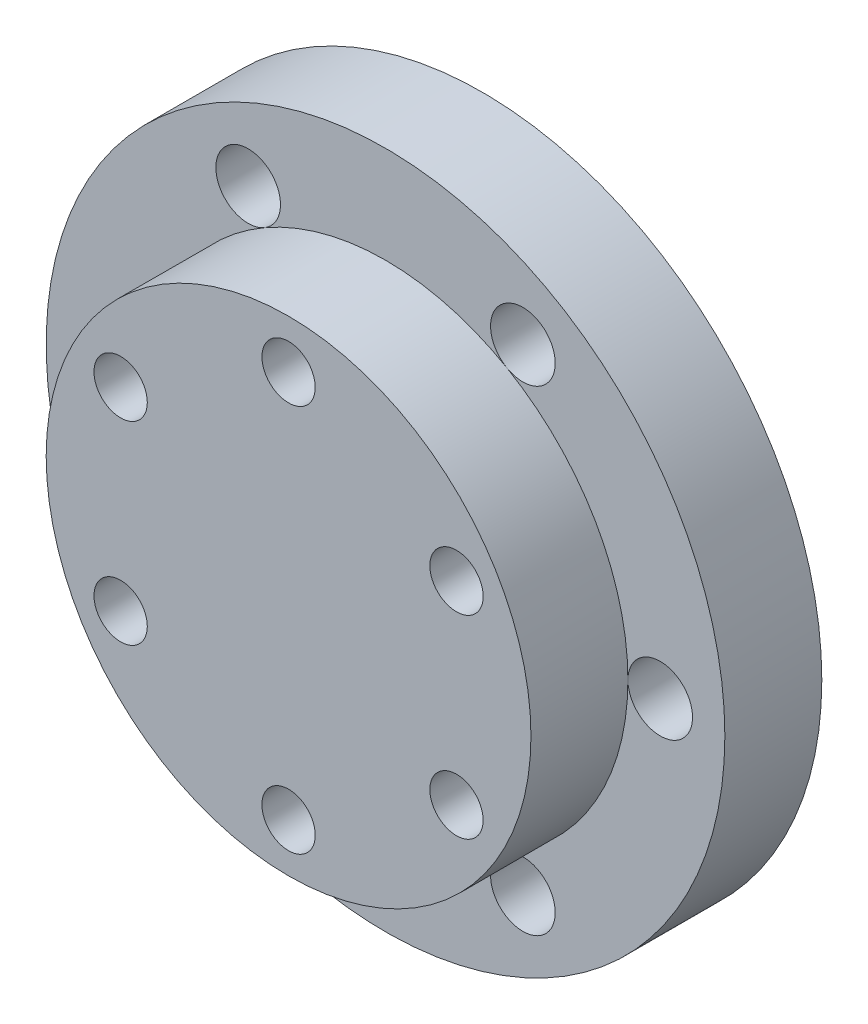
ISO-10303-21;
HEADER;
FILE_DESCRIPTION(('STEP AP214'),'2;1');
FILE_NAME('part.step','',(''),(''),'','','');
FILE_SCHEMA(('AUTOMOTIVE_DESIGN { 1 0 10303 214 1 1 1 1 }'));
ENDSEC;
DATA;
#1=APPLICATION_CONTEXT('core data for automotive mechanical design processes');
#2=APPLICATION_PROTOCOL_DEFINITION('international standard','automotive_design',2000,#1);
#3=PRODUCT_CONTEXT('',#1,'mechanical');
#4=PRODUCT('Part','Part','',(#3));
#5=PRODUCT_RELATED_PRODUCT_CATEGORY('part','',(#4));
#6=PRODUCT_DEFINITION_FORMATION('','',#4);
#7=PRODUCT_DEFINITION_CONTEXT('part definition',#1,'design');
#8=PRODUCT_DEFINITION('design','',#6,#7);
#9=PRODUCT_DEFINITION_SHAPE('','',#8);
#10=(LENGTH_UNIT() NAMED_UNIT(*) SI_UNIT(.MILLI.,.METRE.));
#11=(NAMED_UNIT(*) PLANE_ANGLE_UNIT() SI_UNIT($,.RADIAN.));
#12=(NAMED_UNIT(*) SI_UNIT($,.STERADIAN.) SOLID_ANGLE_UNIT());
#13=UNCERTAINTY_MEASURE_WITH_UNIT(LENGTH_MEASURE(1.E-05),#10,'distance_accuracy_value','');
#14=(GEOMETRIC_REPRESENTATION_CONTEXT(3) GLOBAL_UNCERTAINTY_ASSIGNED_CONTEXT((#13)) GLOBAL_UNIT_ASSIGNED_CONTEXT((#10,
#11,#12)) REPRESENTATION_CONTEXT('',''));
#15=CARTESIAN_POINT('',(0.,0.,0.));
#16=DIRECTION('',(0.,0.,1.));
#17=DIRECTION('',(1.,0.,0.));
#18=AXIS2_PLACEMENT_3D('',#15,#16,#17);
#19=CARTESIAN_POINT('',(0.,0.,6.));
#20=DIRECTION('',(0.,0.,1.));
#21=DIRECTION('',(1.,0.,0.));
#22=AXIS2_PLACEMENT_3D('',#19,#20,#21);
#23=PLANE('',#22);
#24=CARTESIAN_POINT('',(0.,0.,6.));
#25=DIRECTION('',(0.,0.,1.));
#26=DIRECTION('',(1.,0.,0.));
#27=AXIS2_PLACEMENT_3D('',#24,#25,#26);
#28=CIRCLE('',#27,15.);
#29=CARTESIAN_POINT('',(15.,0.,6.));
#30=VERTEX_POINT('',#29);
#31=CARTESIAN_POINT('',(7.5,12.9903810567666,6.));
#32=VERTEX_POINT('',#31);
#33=EDGE_CURVE('E57',#30,#32,#28,.T.);
#34=ORIENTED_EDGE('',*,*,#33,.F.);
#35=CARTESIAN_POINT('',(17.,0.,6.));
#36=DIRECTION('',(0.,0.,1.));
#37=DIRECTION('',(1.,0.,0.));
#38=AXIS2_PLACEMENT_3D('',#35,#36,#37);
#39=CIRCLE('',#38,2.);
#40=EDGE_CURVE('E194',#30,#30,#39,.T.);
#41=ORIENTED_EDGE('',*,*,#40,.F.);
#42=CARTESIAN_POINT('',(7.50000000000001,-12.9903810567666,6.));
#43=VERTEX_POINT('',#42);
#44=EDGE_CURVE('E178',#43,#30,#28,.T.);
#45=ORIENTED_EDGE('',*,*,#44,.F.);
#46=CARTESIAN_POINT('',(8.50000000000001,-14.7224318643355,6.));
#47=DIRECTION('',(0.,0.,1.));
#48=DIRECTION('',(1.,0.,0.));
#49=AXIS2_PLACEMENT_3D('',#46,#47,#48);
#50=CIRCLE('',#49,2.);
#51=EDGE_CURVE('E184',#43,#43,#50,.T.);
#52=ORIENTED_EDGE('',*,*,#51,.F.);
#53=CARTESIAN_POINT('',(-7.5,-12.9903810567666,6.));
#54=VERTEX_POINT('',#53);
#55=EDGE_CURVE('E63',#54,#43,#28,.T.);
#56=ORIENTED_EDGE('',*,*,#55,.F.);
#57=CARTESIAN_POINT('',(-8.5,-14.7224318643355,6.));
#58=DIRECTION('',(0.,0.,1.));
#59=DIRECTION('',(1.,0.,0.));
#60=AXIS2_PLACEMENT_3D('',#57,#58,#59);
#61=CIRCLE('',#60,2.);
#62=EDGE_CURVE('E179',#54,#54,#61,.T.);
#63=ORIENTED_EDGE('',*,*,#62,.F.);
#64=CARTESIAN_POINT('',(-15.,0.,6.));
#65=VERTEX_POINT('',#64);
#66=EDGE_CURVE('E291',#65,#54,#28,.T.);
#67=ORIENTED_EDGE('',*,*,#66,.F.);
#68=CARTESIAN_POINT('',(-17.,0.,6.));
#69=DIRECTION('',(0.,0.,1.));
#70=DIRECTION('',(1.,0.,0.));
#71=AXIS2_PLACEMENT_3D('',#68,#69,#70);
#72=CIRCLE('',#71,2.);
#73=EDGE_CURVE('E214',#65,#65,#72,.T.);
#74=ORIENTED_EDGE('',*,*,#73,.F.);
#75=CARTESIAN_POINT('',(-7.5,12.9903810567666,6.));
#76=VERTEX_POINT('',#75);
#77=EDGE_CURVE('E53',#76,#65,#28,.T.);
#78=ORIENTED_EDGE('',*,*,#77,.F.);
#79=CARTESIAN_POINT('',(-8.5,14.7224318643355,6.));
#80=DIRECTION('',(0.,0.,1.));
#81=DIRECTION('',(1.,0.,0.));
#82=AXIS2_PLACEMENT_3D('',#79,#80,#81);
#83=CIRCLE('',#82,2.00000000000001);
#84=EDGE_CURVE('E208',#76,#76,#83,.T.);
#85=ORIENTED_EDGE('',*,*,#84,.F.);
#86=EDGE_CURVE('E11',#32,#76,#28,.T.);
#87=ORIENTED_EDGE('',*,*,#86,.F.);
#88=CARTESIAN_POINT('',(8.5,14.7224318643355,6.));
#89=DIRECTION('',(0.,0.,1.));
#90=DIRECTION('',(1.,0.,0.));
#91=AXIS2_PLACEMENT_3D('',#88,#89,#90);
#92=CIRCLE('',#91,2.00000000000001);
#93=EDGE_CURVE('E199',#32,#32,#92,.T.);
#94=ORIENTED_EDGE('',*,*,#93,.F.);
#95=EDGE_LOOP('',(#34,#41,#45,#52,#56,#63,#67,#74,#78,#85,#87,#94));
#96=FACE_BOUND('',#95,.T.);
#97=CARTESIAN_POINT('',(0.,0.,6.));
#98=DIRECTION('',(0.,0.,1.));
#99=DIRECTION('',(1.,0.,0.));
#100=AXIS2_PLACEMENT_3D('',#97,#98,#99);
#101=CIRCLE('',#100,21.);
#102=CARTESIAN_POINT('',(21.,0.,6.));
#103=VERTEX_POINT('',#102);
#104=EDGE_CURVE('E222',#103,#103,#101,.T.);
#105=ORIENTED_EDGE('',*,*,#104,.T.);
#106=EDGE_LOOP('',(#105));
#107=FACE_BOUND('',#106,.T.);
#108=ADVANCED_FACE('F42',(#96,#107),#23,.T.);
#109=CARTESIAN_POINT('',(0.,0.,0.));
#110=DIRECTION('',(0.,0.,1.));
#111=DIRECTION('',(1.,0.,0.));
#112=AXIS2_PLACEMENT_3D('',#109,#110,#111);
#113=PLANE('',#112);
#114=CARTESIAN_POINT('',(0.,0.,0.));
#115=DIRECTION('',(0.,0.,-1.));
#116=DIRECTION('',(-1.,0.,0.));
#117=AXIS2_PLACEMENT_3D('',#114,#115,#116);
#118=CIRCLE('',#117,6.34999999999999);
#119=CARTESIAN_POINT('',(-6.34999999999999,0.,0.));
#120=VERTEX_POINT('',#119);
#121=EDGE_CURVE('E117',#120,#120,#118,.T.);
#122=ORIENTED_EDGE('',*,*,#121,.F.);
#123=EDGE_LOOP('',(#122));
#124=FACE_BOUND('',#123,.T.);
#125=CARTESIAN_POINT('',(0.,0.,0.));
#126=DIRECTION('',(0.,0.,1.));
#127=DIRECTION('',(1.,0.,0.));
#128=AXIS2_PLACEMENT_3D('',#125,#126,#127);
#129=CIRCLE('',#128,21.);
#130=CARTESIAN_POINT('',(21.,0.,0.));
#131=VERTEX_POINT('',#130);
#132=EDGE_CURVE('E48',#131,#131,#129,.T.);
#133=ORIENTED_EDGE('',*,*,#132,.F.);
#134=EDGE_LOOP('',(#133));
#135=FACE_BOUND('',#134,.T.);
#136=CARTESIAN_POINT('',(-17.,0.,0.));
#137=DIRECTION('',(0.,0.,1.));
#138=DIRECTION('',(1.,0.,0.));
#139=AXIS2_PLACEMENT_3D('',#136,#137,#138);
#140=CIRCLE('',#139,2.);
#141=CARTESIAN_POINT('',(-15.,0.,0.));
#142=VERTEX_POINT('',#141);
#143=EDGE_CURVE('E211',#142,#142,#140,.T.);
#144=ORIENTED_EDGE('',*,*,#143,.T.);
#145=EDGE_LOOP('',(#144));
#146=FACE_BOUND('',#145,.T.);
#147=CARTESIAN_POINT('',(-8.5,14.7224318643355,0.));
#148=DIRECTION('',(0.,0.,1.));
#149=DIRECTION('',(1.,0.,0.));
#150=AXIS2_PLACEMENT_3D('',#147,#148,#149);
#151=CIRCLE('',#150,2.00000000000001);
#152=CARTESIAN_POINT('',(-6.5,14.7224318643355,0.));
#153=VERTEX_POINT('',#152);
#154=EDGE_CURVE('E204',#153,#153,#151,.T.);
#155=ORIENTED_EDGE('',*,*,#154,.T.);
#156=EDGE_LOOP('',(#155));
#157=FACE_BOUND('',#156,.T.);
#158=CARTESIAN_POINT('',(8.5,14.7224318643355,0.));
#159=DIRECTION('',(0.,0.,1.));
#160=DIRECTION('',(1.,0.,0.));
#161=AXIS2_PLACEMENT_3D('',#158,#159,#160);
#162=CIRCLE('',#161,2.00000000000001);
#163=CARTESIAN_POINT('',(10.5,14.7224318643355,0.));
#164=VERTEX_POINT('',#163);
#165=EDGE_CURVE('E198',#164,#164,#162,.T.);
#166=ORIENTED_EDGE('',*,*,#165,.T.);
#167=EDGE_LOOP('',(#166));
#168=FACE_BOUND('',#167,.T.);
#169=CARTESIAN_POINT('',(17.,0.,0.));
#170=DIRECTION('',(0.,0.,1.));
#171=DIRECTION('',(1.,0.,0.));
#172=AXIS2_PLACEMENT_3D('',#169,#170,#171);
#173=CIRCLE('',#172,2.);
#174=CARTESIAN_POINT('',(19.,0.,0.));
#175=VERTEX_POINT('',#174);
#176=EDGE_CURVE('E188',#175,#175,#173,.T.);
#177=ORIENTED_EDGE('',*,*,#176,.T.);
#178=EDGE_LOOP('',(#177));
#179=FACE_BOUND('',#178,.T.);
#180=CARTESIAN_POINT('',(8.50000000000001,-14.7224318643355,0.));
#181=DIRECTION('',(0.,0.,1.));
#182=DIRECTION('',(1.,0.,0.));
#183=AXIS2_PLACEMENT_3D('',#180,#181,#182);
#184=CIRCLE('',#183,2.);
#185=CARTESIAN_POINT('',(10.5,-14.7224318643355,0.));
#186=VERTEX_POINT('',#185);
#187=EDGE_CURVE('E176',#186,#186,#184,.T.);
#188=ORIENTED_EDGE('',*,*,#187,.T.);
#189=EDGE_LOOP('',(#188));
#190=FACE_BOUND('',#189,.T.);
#191=CARTESIAN_POINT('',(-8.5,-14.7224318643355,0.));
#192=DIRECTION('',(0.,0.,1.));
#193=DIRECTION('',(1.,0.,0.));
#194=AXIS2_PLACEMENT_3D('',#191,#192,#193);
#195=CIRCLE('',#194,2.);
#196=CARTESIAN_POINT('',(-6.5,-14.7224318643355,0.));
#197=VERTEX_POINT('',#196);
#198=EDGE_CURVE('E175',#197,#197,#195,.T.);
#199=ORIENTED_EDGE('',*,*,#198,.T.);
#200=EDGE_LOOP('',(#199));
#201=FACE_BOUND('',#200,.T.);
#202=ADVANCED_FACE('F232',(#124,#135,#146,#157,#168,#179,#190,#201),#113,.F.);
#203=CARTESIAN_POINT('',(0.,0.,6.));
#204=DIRECTION('',(0.,0.,-1.));
#205=DIRECTION('',(-1.,0.,0.));
#206=AXIS2_PLACEMENT_3D('',#203,#204,#205);
#207=CYLINDRICAL_SURFACE('',#206,21.);
#208=ORIENTED_EDGE('',*,*,#104,.F.);
#209=EDGE_LOOP('',(#208));
#210=FACE_BOUND('',#209,.T.);
#211=ORIENTED_EDGE('',*,*,#132,.T.);
#212=EDGE_LOOP('',(#211));
#213=FACE_BOUND('',#212,.T.);
#214=ADVANCED_FACE('F46',(#210,#213),#207,.T.);
#215=CARTESIAN_POINT('',(-17.,0.,6.));
#216=DIRECTION('',(0.,0.,-1.));
#217=DIRECTION('',(-1.,0.,0.));
#218=AXIS2_PLACEMENT_3D('',#215,#216,#217);
#219=CYLINDRICAL_SURFACE('',#218,2.);
#220=ORIENTED_EDGE('',*,*,#73,.T.);
#221=EDGE_LOOP('',(#220));
#222=FACE_BOUND('',#221,.T.);
#223=ORIENTED_EDGE('',*,*,#143,.F.);
#224=EDGE_LOOP('',(#223));
#225=FACE_BOUND('',#224,.T.);
#226=ADVANCED_FACE('F272',(#222,#225),#219,.F.);
#227=CARTESIAN_POINT('',(-8.5,14.7224318643355,6.));
#228=DIRECTION('',(0.,0.,-1.));
#229=DIRECTION('',(-1.,0.,0.));
#230=AXIS2_PLACEMENT_3D('',#227,#228,#229);
#231=CYLINDRICAL_SURFACE('',#230,2.00000000000001);
#232=ORIENTED_EDGE('',*,*,#84,.T.);
#233=EDGE_LOOP('',(#232));
#234=FACE_BOUND('',#233,.T.);
#235=ORIENTED_EDGE('',*,*,#154,.F.);
#236=EDGE_LOOP('',(#235));
#237=FACE_BOUND('',#236,.T.);
#238=ADVANCED_FACE('F274',(#234,#237),#231,.F.);
#239=CARTESIAN_POINT('',(8.5,14.7224318643355,6.));
#240=DIRECTION('',(0.,0.,-1.));
#241=DIRECTION('',(-1.,0.,0.));
#242=AXIS2_PLACEMENT_3D('',#239,#240,#241);
#243=CYLINDRICAL_SURFACE('',#242,2.00000000000001);
#244=ORIENTED_EDGE('',*,*,#93,.T.);
#245=EDGE_LOOP('',(#244));
#246=FACE_BOUND('',#245,.T.);
#247=ORIENTED_EDGE('',*,*,#165,.F.);
#248=EDGE_LOOP('',(#247));
#249=FACE_BOUND('',#248,.T.);
#250=ADVANCED_FACE('F276',(#246,#249),#243,.F.);
#251=CARTESIAN_POINT('',(17.,0.,6.));
#252=DIRECTION('',(0.,0.,-1.));
#253=DIRECTION('',(-1.,0.,0.));
#254=AXIS2_PLACEMENT_3D('',#251,#252,#253);
#255=CYLINDRICAL_SURFACE('',#254,2.);
#256=ORIENTED_EDGE('',*,*,#40,.T.);
#257=EDGE_LOOP('',(#256));
#258=FACE_BOUND('',#257,.T.);
#259=ORIENTED_EDGE('',*,*,#176,.F.);
#260=EDGE_LOOP('',(#259));
#261=FACE_BOUND('',#260,.T.);
#262=ADVANCED_FACE('F265',(#258,#261),#255,.F.);
#263=CARTESIAN_POINT('',(8.50000000000001,-14.7224318643355,6.));
#264=DIRECTION('',(0.,0.,-1.));
#265=DIRECTION('',(-1.,0.,0.));
#266=AXIS2_PLACEMENT_3D('',#263,#264,#265);
#267=CYLINDRICAL_SURFACE('',#266,2.);
#268=ORIENTED_EDGE('',*,*,#51,.T.);
#269=EDGE_LOOP('',(#268));
#270=FACE_BOUND('',#269,.T.);
#271=ORIENTED_EDGE('',*,*,#187,.F.);
#272=EDGE_LOOP('',(#271));
#273=FACE_BOUND('',#272,.T.);
#274=ADVANCED_FACE('F252',(#270,#273),#267,.F.);
#275=CARTESIAN_POINT('',(-8.5,-14.7224318643355,6.));
#276=DIRECTION('',(0.,0.,-1.));
#277=DIRECTION('',(-1.,0.,0.));
#278=AXIS2_PLACEMENT_3D('',#275,#276,#277);
#279=CYLINDRICAL_SURFACE('',#278,2.);
#280=ORIENTED_EDGE('',*,*,#62,.T.);
#281=EDGE_LOOP('',(#280));
#282=FACE_BOUND('',#281,.T.);
#283=ORIENTED_EDGE('',*,*,#198,.F.);
#284=EDGE_LOOP('',(#283));
#285=FACE_BOUND('',#284,.T.);
#286=ADVANCED_FACE('F250',(#282,#285),#279,.F.);
#287=CARTESIAN_POINT('',(0.,0.,12.));
#288=DIRECTION('',(0.,0.,-1.));
#289=DIRECTION('',(-1.,0.,0.));
#290=AXIS2_PLACEMENT_3D('',#287,#288,#289);
#291=CYLINDRICAL_SURFACE('',#290,15.);
#292=CARTESIAN_POINT('',(0.,0.,12.));
#293=DIRECTION('',(0.,0.,1.));
#294=DIRECTION('',(1.,0.,0.));
#295=AXIS2_PLACEMENT_3D('',#292,#293,#294);
#296=CIRCLE('',#295,15.);
#297=CARTESIAN_POINT('',(15.,0.,12.));
#298=VERTEX_POINT('',#297);
#299=EDGE_CURVE('E166',#298,#298,#296,.T.);
#300=ORIENTED_EDGE('',*,*,#299,.F.);
#301=EDGE_LOOP('',(#300));
#302=FACE_BOUND('',#301,.T.);
#303=ORIENTED_EDGE('',*,*,#33,.T.);
#304=ORIENTED_EDGE('',*,*,#86,.T.);
#305=ORIENTED_EDGE('',*,*,#77,.T.);
#306=ORIENTED_EDGE('',*,*,#66,.T.);
#307=ORIENTED_EDGE('',*,*,#55,.T.);
#308=ORIENTED_EDGE('',*,*,#44,.T.);
#309=EDGE_LOOP('',(#303,#304,#305,#306,#307,#308));
#310=FACE_BOUND('',#309,.T.);
#311=ADVANCED_FACE('F253',(#302,#310),#291,.T.);
#312=CARTESIAN_POINT('',(0.,0.,12.));
#313=DIRECTION('',(0.,0.,1.));
#314=DIRECTION('',(1.,0.,0.));
#315=AXIS2_PLACEMENT_3D('',#312,#313,#314);
#316=PLANE('',#315);
#317=CARTESIAN_POINT('',(-10.3923048454133,-6.00000000000001,12.));
#318=DIRECTION('',(0.,0.,1.));
#319=DIRECTION('',(1.,0.,0.));
#320=AXIS2_PLACEMENT_3D('',#317,#318,#319);
#321=CIRCLE('',#320,1.65);
#322=CARTESIAN_POINT('',(-8.74230484541326,-6.00000000000001,12.));
#323=VERTEX_POINT('',#322);
#324=EDGE_CURVE('E113',#323,#323,#321,.T.);
#325=ORIENTED_EDGE('',*,*,#324,.F.);
#326=EDGE_LOOP('',(#325));
#327=FACE_BOUND('',#326,.T.);
#328=CARTESIAN_POINT('',(-10.3923048454133,6.,12.));
#329=DIRECTION('',(0.,0.,1.));
#330=DIRECTION('',(1.,0.,0.));
#331=AXIS2_PLACEMENT_3D('',#328,#329,#330);
#332=CIRCLE('',#331,1.65);
#333=CARTESIAN_POINT('',(-8.74230484541327,6.,12.));
#334=VERTEX_POINT('',#333);
#335=EDGE_CURVE('E129',#334,#334,#332,.T.);
#336=ORIENTED_EDGE('',*,*,#335,.F.);
#337=EDGE_LOOP('',(#336));
#338=FACE_BOUND('',#337,.T.);
#339=CARTESIAN_POINT('',(0.,12.,12.));
#340=DIRECTION('',(0.,0.,1.));
#341=DIRECTION('',(1.,0.,0.));
#342=AXIS2_PLACEMENT_3D('',#339,#340,#341);
#343=CIRCLE('',#342,1.65);
#344=CARTESIAN_POINT('',(1.65,12.,12.));
#345=VERTEX_POINT('',#344);
#346=EDGE_CURVE('E139',#345,#345,#343,.T.);
#347=ORIENTED_EDGE('',*,*,#346,.F.);
#348=EDGE_LOOP('',(#347));
#349=FACE_BOUND('',#348,.T.);
#350=CARTESIAN_POINT('',(10.3923048454133,6.,12.));
#351=DIRECTION('',(0.,0.,1.));
#352=DIRECTION('',(1.,0.,0.));
#353=AXIS2_PLACEMENT_3D('',#350,#351,#352);
#354=CIRCLE('',#353,1.65);
#355=CARTESIAN_POINT('',(12.0423048454133,6.,12.));
#356=VERTEX_POINT('',#355);
#357=EDGE_CURVE('E144',#356,#356,#354,.T.);
#358=ORIENTED_EDGE('',*,*,#357,.F.);
#359=EDGE_LOOP('',(#358));
#360=FACE_BOUND('',#359,.T.);
#361=CARTESIAN_POINT('',(10.3923048454133,-6.,12.));
#362=DIRECTION('',(0.,0.,1.));
#363=DIRECTION('',(1.,0.,0.));
#364=AXIS2_PLACEMENT_3D('',#361,#362,#363);
#365=CIRCLE('',#364,1.65);
#366=CARTESIAN_POINT('',(12.0423048454133,-6.,12.));
#367=VERTEX_POINT('',#366);
#368=EDGE_CURVE('E153',#367,#367,#365,.T.);
#369=ORIENTED_EDGE('',*,*,#368,.F.);
#370=EDGE_LOOP('',(#369));
#371=FACE_BOUND('',#370,.T.);
#372=CARTESIAN_POINT('',(0.,-12.,12.));
#373=DIRECTION('',(0.,0.,1.));
#374=DIRECTION('',(1.,0.,0.));
#375=AXIS2_PLACEMENT_3D('',#372,#373,#374);
#376=CIRCLE('',#375,1.65);
#377=CARTESIAN_POINT('',(1.65,-12.,12.));
#378=VERTEX_POINT('',#377);
#379=EDGE_CURVE('E161',#378,#378,#376,.T.);
#380=ORIENTED_EDGE('',*,*,#379,.F.);
#381=EDGE_LOOP('',(#380));
#382=FACE_BOUND('',#381,.T.);
#383=ORIENTED_EDGE('',*,*,#299,.T.);
#384=EDGE_LOOP('',(#383));
#385=FACE_BOUND('',#384,.T.);
#386=ADVANCED_FACE('F259',(#327,#338,#349,#360,#371,#382,#385),#316,.T.);
#387=CARTESIAN_POINT('',(0.,-12.,6.));
#388=DIRECTION('',(0.,0.,1.));
#389=DIRECTION('',(1.,0.,0.));
#390=AXIS2_PLACEMENT_3D('',#387,#388,#389);
#391=CONICAL_SURFACE('',#390,1.65,1.02974425867665);
#392=CARTESIAN_POINT('',(0.,-12.,5.00857997860453));
#393=VERTEX_POINT('',#392);
#394=VERTEX_LOOP('',#393);
#395=FACE_BOUND('',#394,.T.);
#396=CARTESIAN_POINT('',(0.,-12.,6.));
#397=DIRECTION('',(0.,0.,1.));
#398=DIRECTION('',(1.,0.,0.));
#399=AXIS2_PLACEMENT_3D('',#396,#397,#398);
#400=CIRCLE('',#399,1.65);
#401=CARTESIAN_POINT('',(1.65,-12.,6.));
#402=VERTEX_POINT('',#401);
#403=EDGE_CURVE('E164',#402,#402,#400,.T.);
#404=ORIENTED_EDGE('',*,*,#403,.T.);
#405=EDGE_LOOP('',(#404));
#406=FACE_BOUND('',#405,.T.);
#407=ADVANCED_FACE('F330',(#395,#406),#391,.F.);
#408=CARTESIAN_POINT('',(0.,-12.,12.));
#409=DIRECTION('',(0.,0.,1.));
#410=DIRECTION('',(1.,0.,0.));
#411=AXIS2_PLACEMENT_3D('',#408,#409,#410);
#412=CYLINDRICAL_SURFACE('',#411,1.65);
#413=ORIENTED_EDGE('',*,*,#403,.F.);
#414=EDGE_LOOP('',(#413));
#415=FACE_BOUND('',#414,.T.);
#416=ORIENTED_EDGE('',*,*,#379,.T.);
#417=EDGE_LOOP('',(#416));
#418=FACE_BOUND('',#417,.T.);
#419=ADVANCED_FACE('F340',(#415,#418),#412,.F.);
#420=CARTESIAN_POINT('',(10.3923048454133,-6.,6.));
#421=DIRECTION('',(0.,0.,1.));
#422=DIRECTION('',(1.,0.,0.));
#423=AXIS2_PLACEMENT_3D('',#420,#421,#422);
#424=CONICAL_SURFACE('',#423,1.65,1.02974425867665);
#425=CARTESIAN_POINT('',(10.3923048454133,-6.,5.00857997860453));
#426=VERTEX_POINT('',#425);
#427=VERTEX_LOOP('',#426);
#428=FACE_BOUND('',#427,.T.);
#429=CARTESIAN_POINT('',(10.3923048454133,-6.,6.));
#430=DIRECTION('',(0.,0.,1.));
#431=DIRECTION('',(1.,0.,0.));
#432=AXIS2_PLACEMENT_3D('',#429,#430,#431);
#433=CIRCLE('',#432,1.65);
#434=CARTESIAN_POINT('',(12.0423048454133,-6.,6.));
#435=VERTEX_POINT('',#434);
#436=EDGE_CURVE('E160',#435,#435,#433,.T.);
#437=ORIENTED_EDGE('',*,*,#436,.T.);
#438=EDGE_LOOP('',(#437));
#439=FACE_BOUND('',#438,.T.);
#440=ADVANCED_FACE('F350',(#428,#439),#424,.F.);
#441=CARTESIAN_POINT('',(10.3923048454133,-6.,12.));
#442=DIRECTION('',(0.,0.,1.));
#443=DIRECTION('',(1.,0.,0.));
#444=AXIS2_PLACEMENT_3D('',#441,#442,#443);
#445=CYLINDRICAL_SURFACE('',#444,1.65);
#446=ORIENTED_EDGE('',*,*,#436,.F.);
#447=EDGE_LOOP('',(#446));
#448=FACE_BOUND('',#447,.T.);
#449=ORIENTED_EDGE('',*,*,#368,.T.);
#450=EDGE_LOOP('',(#449));
#451=FACE_BOUND('',#450,.T.);
#452=ADVANCED_FACE('F359',(#448,#451),#445,.F.);
#453=CARTESIAN_POINT('',(10.3923048454133,6.,6.));
#454=DIRECTION('',(0.,0.,1.));
#455=DIRECTION('',(1.,0.,0.));
#456=AXIS2_PLACEMENT_3D('',#453,#454,#455);
#457=CONICAL_SURFACE('',#456,1.65,1.02974425867665);
#458=CARTESIAN_POINT('',(10.3923048454133,6.,5.00857997860453));
#459=VERTEX_POINT('',#458);
#460=VERTEX_LOOP('',#459);
#461=FACE_BOUND('',#460,.T.);
#462=CARTESIAN_POINT('',(10.3923048454133,6.,6.));
#463=DIRECTION('',(0.,0.,1.));
#464=DIRECTION('',(1.,0.,0.));
#465=AXIS2_PLACEMENT_3D('',#462,#463,#464);
#466=CIRCLE('',#465,1.65);
#467=CARTESIAN_POINT('',(12.0423048454133,6.,6.));
#468=VERTEX_POINT('',#467);
#469=EDGE_CURVE('E149',#468,#468,#466,.T.);
#470=ORIENTED_EDGE('',*,*,#469,.T.);
#471=EDGE_LOOP('',(#470));
#472=FACE_BOUND('',#471,.T.);
#473=ADVANCED_FACE('F370',(#461,#472),#457,.F.);
#474=CARTESIAN_POINT('',(10.3923048454133,6.,12.));
#475=DIRECTION('',(0.,0.,1.));
#476=DIRECTION('',(1.,0.,0.));
#477=AXIS2_PLACEMENT_3D('',#474,#475,#476);
#478=CYLINDRICAL_SURFACE('',#477,1.65);
#479=ORIENTED_EDGE('',*,*,#469,.F.);
#480=EDGE_LOOP('',(#479));
#481=FACE_BOUND('',#480,.T.);
#482=ORIENTED_EDGE('',*,*,#357,.T.);
#483=EDGE_LOOP('',(#482));
#484=FACE_BOUND('',#483,.T.);
#485=ADVANCED_FACE('F380',(#481,#484),#478,.F.);
#486=CARTESIAN_POINT('',(0.,12.,6.));
#487=DIRECTION('',(0.,0.,1.));
#488=DIRECTION('',(1.,0.,0.));
#489=AXIS2_PLACEMENT_3D('',#486,#487,#488);
#490=CONICAL_SURFACE('',#489,1.65,1.02974425867665);
#491=CARTESIAN_POINT('',(0.,12.,5.00857997860453));
#492=VERTEX_POINT('',#491);
#493=VERTEX_LOOP('',#492);
#494=FACE_BOUND('',#493,.T.);
#495=CARTESIAN_POINT('',(0.,12.,6.));
#496=DIRECTION('',(0.,0.,1.));
#497=DIRECTION('',(1.,0.,0.));
#498=AXIS2_PLACEMENT_3D('',#495,#496,#497);
#499=CIRCLE('',#498,1.65);
#500=CARTESIAN_POINT('',(1.65,12.,6.));
#501=VERTEX_POINT('',#500);
#502=EDGE_CURVE('E143',#501,#501,#499,.T.);
#503=ORIENTED_EDGE('',*,*,#502,.T.);
#504=EDGE_LOOP('',(#503));
#505=FACE_BOUND('',#504,.T.);
#506=ADVANCED_FACE('F390',(#494,#505),#490,.F.);
#507=CARTESIAN_POINT('',(0.,12.,12.));
#508=DIRECTION('',(0.,0.,1.));
#509=DIRECTION('',(1.,0.,0.));
#510=AXIS2_PLACEMENT_3D('',#507,#508,#509);
#511=CYLINDRICAL_SURFACE('',#510,1.65);
#512=ORIENTED_EDGE('',*,*,#502,.F.);
#513=EDGE_LOOP('',(#512));
#514=FACE_BOUND('',#513,.T.);
#515=ORIENTED_EDGE('',*,*,#346,.T.);
#516=EDGE_LOOP('',(#515));
#517=FACE_BOUND('',#516,.T.);
#518=ADVANCED_FACE('F399',(#514,#517),#511,.F.);
#519=CARTESIAN_POINT('',(-10.3923048454133,6.,6.));
#520=DIRECTION('',(0.,0.,1.));
#521=DIRECTION('',(1.,0.,0.));
#522=AXIS2_PLACEMENT_3D('',#519,#520,#521);
#523=CONICAL_SURFACE('',#522,1.65,1.02974425867665);
#524=CARTESIAN_POINT('',(-10.3923048454133,6.,5.00857997860453));
#525=VERTEX_POINT('',#524);
#526=VERTEX_LOOP('',#525);
#527=FACE_BOUND('',#526,.T.);
#528=CARTESIAN_POINT('',(-10.3923048454133,6.,6.));
#529=DIRECTION('',(0.,0.,1.));
#530=DIRECTION('',(1.,0.,0.));
#531=AXIS2_PLACEMENT_3D('',#528,#529,#530);
#532=CIRCLE('',#531,1.65);
#533=CARTESIAN_POINT('',(-8.74230484541327,6.,6.));
#534=VERTEX_POINT('',#533);
#535=EDGE_CURVE('E133',#534,#534,#532,.T.);
#536=ORIENTED_EDGE('',*,*,#535,.T.);
#537=EDGE_LOOP('',(#536));
#538=FACE_BOUND('',#537,.T.);
#539=ADVANCED_FACE('F410',(#527,#538),#523,.F.);
#540=CARTESIAN_POINT('',(-10.3923048454133,6.,12.));
#541=DIRECTION('',(0.,0.,1.));
#542=DIRECTION('',(1.,0.,0.));
#543=AXIS2_PLACEMENT_3D('',#540,#541,#542);
#544=CYLINDRICAL_SURFACE('',#543,1.65);
#545=ORIENTED_EDGE('',*,*,#535,.F.);
#546=EDGE_LOOP('',(#545));
#547=FACE_BOUND('',#546,.T.);
#548=ORIENTED_EDGE('',*,*,#335,.T.);
#549=EDGE_LOOP('',(#548));
#550=FACE_BOUND('',#549,.T.);
#551=ADVANCED_FACE('F417',(#547,#550),#544,.F.);
#552=CARTESIAN_POINT('',(-10.3923048454133,-6.00000000000001,6.));
#553=DIRECTION('',(0.,0.,1.));
#554=DIRECTION('',(1.,0.,0.));
#555=AXIS2_PLACEMENT_3D('',#552,#553,#554);
#556=CONICAL_SURFACE('',#555,1.65,1.02974425867665);
#557=CARTESIAN_POINT('',(-10.3923048454133,-6.00000000000001,5.00857997860453));
#558=VERTEX_POINT('',#557);
#559=VERTEX_LOOP('',#558);
#560=FACE_BOUND('',#559,.T.);
#561=CARTESIAN_POINT('',(-10.3923048454133,-6.00000000000001,6.));
#562=DIRECTION('',(0.,0.,1.));
#563=DIRECTION('',(1.,0.,0.));
#564=AXIS2_PLACEMENT_3D('',#561,#562,#563);
#565=CIRCLE('',#564,1.65);
#566=CARTESIAN_POINT('',(-8.74230484541326,-6.00000000000001,6.));
#567=VERTEX_POINT('',#566);
#568=EDGE_CURVE('E123',#567,#567,#565,.T.);
#569=ORIENTED_EDGE('',*,*,#568,.T.);
#570=EDGE_LOOP('',(#569));
#571=FACE_BOUND('',#570,.T.);
#572=ADVANCED_FACE('F430',(#560,#571),#556,.F.);
#573=CARTESIAN_POINT('',(-10.3923048454133,-6.00000000000001,12.));
#574=DIRECTION('',(0.,0.,1.));
#575=DIRECTION('',(1.,0.,0.));
#576=AXIS2_PLACEMENT_3D('',#573,#574,#575);
#577=CYLINDRICAL_SURFACE('',#576,1.65);
#578=ORIENTED_EDGE('',*,*,#568,.F.);
#579=EDGE_LOOP('',(#578));
#580=FACE_BOUND('',#579,.T.);
#581=ORIENTED_EDGE('',*,*,#324,.T.);
#582=EDGE_LOOP('',(#581));
#583=FACE_BOUND('',#582,.T.);
#584=ADVANCED_FACE('F107',(#580,#583),#577,.F.);
#585=CARTESIAN_POINT('',(0.,0.,6.00000000000001));
#586=DIRECTION('',(0.,0.,-1.));
#587=DIRECTION('',(-1.,0.,0.));
#588=AXIS2_PLACEMENT_3D('',#585,#586,#587);
#589=CONICAL_SURFACE('',#588,6.34999999999999,1.02974425867666);
#590=CARTESIAN_POINT('',(0.,0.,9.815464930825));
#591=VERTEX_POINT('',#590);
#592=VERTEX_LOOP('',#591);
#593=FACE_BOUND('',#592,.T.);
#594=CARTESIAN_POINT('',(0.,0.,6.00000000000001));
#595=DIRECTION('',(0.,0.,-1.));
#596=DIRECTION('',(-1.,0.,0.));
#597=AXIS2_PLACEMENT_3D('',#594,#595,#596);
#598=CIRCLE('',#597,6.34999999999999);
#599=CARTESIAN_POINT('',(-6.34999999999999,0.,6.00000000000001));
#600=VERTEX_POINT('',#599);
#601=EDGE_CURVE('E115',#600,#600,#598,.T.);
#602=ORIENTED_EDGE('',*,*,#601,.T.);
#603=EDGE_LOOP('',(#602));
#604=FACE_BOUND('',#603,.T.);
#605=ADVANCED_FACE('F102',(#593,#604),#589,.F.);
#606=CARTESIAN_POINT('',(0.,0.,0.));
#607=DIRECTION('',(0.,0.,-1.));
#608=DIRECTION('',(-1.,0.,0.));
#609=AXIS2_PLACEMENT_3D('',#606,#607,#608);
#610=CYLINDRICAL_SURFACE('',#609,6.34999999999999);
#611=ORIENTED_EDGE('',*,*,#601,.F.);
#612=EDGE_LOOP('',(#611));
#613=FACE_BOUND('',#612,.T.);
#614=ORIENTED_EDGE('',*,*,#121,.T.);
#615=EDGE_LOOP('',(#614));
#616=FACE_BOUND('',#615,.T.);
#617=ADVANCED_FACE('F110',(#613,#616),#610,.F.);
#618=CLOSED_SHELL('',(#108,#202,#214,#226,#238,#250,#262,#274,#286,#311,#386,#407,#419,#440,
#452,#473,#485,#506,#518,#539,#551,#572,#584,#605,#617));
#619=MANIFOLD_SOLID_BREP('B2',#618);
#620=ADVANCED_BREP_SHAPE_REPRESENTATION('',(#18,#619),#14);
#621=SHAPE_DEFINITION_REPRESENTATION(#9,#620);
ENDSEC;
END-ISO-10303-21;
